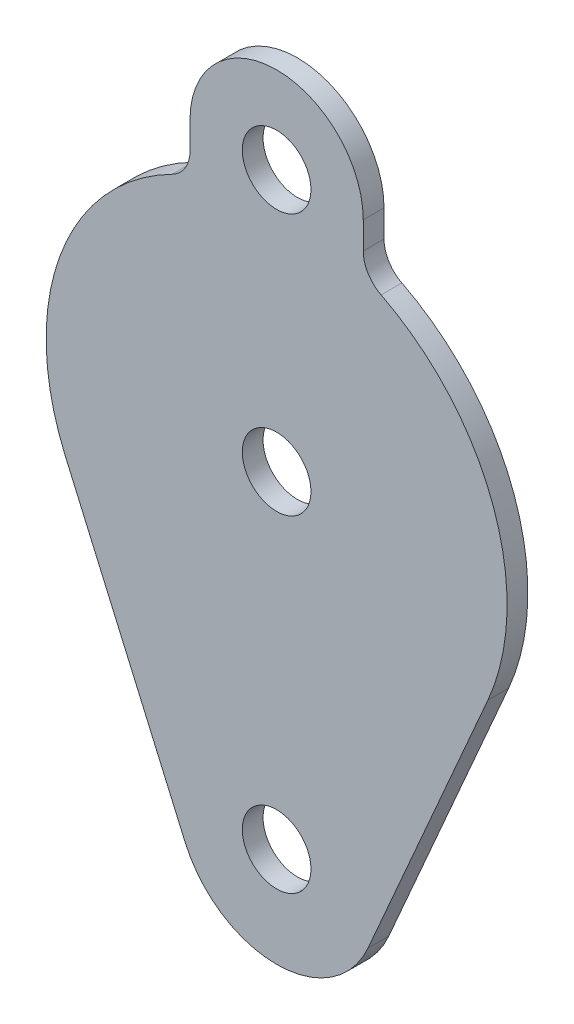
ISO-10303-21;
HEADER;
FILE_DESCRIPTION(('STEP AP214'),'2;1');
FILE_NAME('part.step','',(''),(''),'','','');
FILE_SCHEMA(('AUTOMOTIVE_DESIGN { 1 0 10303 214 1 1 1 1 }'));
ENDSEC;
DATA;
#1=APPLICATION_CONTEXT('core data for automotive mechanical design processes');
#2=APPLICATION_PROTOCOL_DEFINITION('international standard','automotive_design',2000,#1);
#3=PRODUCT_CONTEXT('',#1,'mechanical');
#4=PRODUCT('Part','Part','',(#3));
#5=PRODUCT_RELATED_PRODUCT_CATEGORY('part','',(#4));
#6=PRODUCT_DEFINITION_FORMATION('','',#4);
#7=PRODUCT_DEFINITION_CONTEXT('part definition',#1,'design');
#8=PRODUCT_DEFINITION('design','',#6,#7);
#9=PRODUCT_DEFINITION_SHAPE('','',#8);
#10=(LENGTH_UNIT() NAMED_UNIT(*) SI_UNIT(.MILLI.,.METRE.));
#11=(NAMED_UNIT(*) PLANE_ANGLE_UNIT() SI_UNIT($,.RADIAN.));
#12=(NAMED_UNIT(*) SI_UNIT($,.STERADIAN.) SOLID_ANGLE_UNIT());
#13=UNCERTAINTY_MEASURE_WITH_UNIT(LENGTH_MEASURE(1.E-05),#10,'distance_accuracy_value','');
#14=(GEOMETRIC_REPRESENTATION_CONTEXT(3) GLOBAL_UNCERTAINTY_ASSIGNED_CONTEXT((#13)) GLOBAL_UNIT_ASSIGNED_CONTEXT((#10,
#11,#12)) REPRESENTATION_CONTEXT('',''));
#15=CARTESIAN_POINT('',(0.,0.,0.));
#16=DIRECTION('',(0.,0.,1.));
#17=DIRECTION('',(1.,0.,0.));
#18=AXIS2_PLACEMENT_3D('',#15,#16,#17);
#19=CARTESIAN_POINT('',(-13.2500000000001,-111.042107482795,3.175));
#20=DIRECTION('',(1.,0.,0.));
#21=DIRECTION('',(0.,1.,0.));
#22=AXIS2_PLACEMENT_3D('',#19,#20,#21);
#23=PLANE('',#22);
#24=DIRECTION('',(0.,-1.,0.));
#25=VECTOR('',#24,1.);
#26=CARTESIAN_POINT('',(-13.2500000000001,-111.042107482795,0.));
#27=LINE('',#26,#25);
#28=CARTESIAN_POINT('',(-13.25,40.,0.));
#29=VERTEX_POINT('',#28);
#30=CARTESIAN_POINT('',(-13.25,35.8747822293042,0.));
#31=VERTEX_POINT('',#30);
#32=EDGE_CURVE('E156',#29,#31,#27,.T.);
#33=ORIENTED_EDGE('',*,*,#32,.T.);
#34=DIRECTION('',(0.,0.,1.));
#35=VECTOR('',#34,1.);
#36=CARTESIAN_POINT('',(-13.25,35.8747822293042,3.175));
#37=LINE('',#36,#35);
#38=CARTESIAN_POINT('',(-13.25,35.8747822293042,3.175));
#39=VERTEX_POINT('',#38);
#40=EDGE_CURVE('E47',#31,#39,#37,.T.);
#41=ORIENTED_EDGE('',*,*,#40,.T.);
#42=DIRECTION('',(0.,-1.,0.));
#43=VECTOR('',#42,1.);
#44=CARTESIAN_POINT('',(-13.2500000000001,-111.042107482795,3.175));
#45=LINE('',#44,#43);
#46=CARTESIAN_POINT('',(-13.25,40.,3.175));
#47=VERTEX_POINT('',#46);
#48=EDGE_CURVE('E119',#47,#39,#45,.T.);
#49=ORIENTED_EDGE('',*,*,#48,.F.);
#50=DIRECTION('',(0.,0.,-1.));
#51=VECTOR('',#50,1.);
#52=CARTESIAN_POINT('',(-13.25,40.,3.175));
#53=LINE('',#52,#51);
#54=EDGE_CURVE('E155',#47,#29,#53,.T.);
#55=ORIENTED_EDGE('',*,*,#54,.T.);
#56=EDGE_LOOP('',(#33,#41,#49,#55));
#57=FACE_BOUND('',#56,.T.);
#58=ADVANCED_FACE('F32',(#57),#23,.F.);
#59=CARTESIAN_POINT('',(0.,0.,3.175));
#60=DIRECTION('',(0.,0.,-1.));
#61=DIRECTION('',(-1.,0.,0.));
#62=AXIS2_PLACEMENT_3D('',#59,#60,#61);
#63=CYLINDRICAL_SURFACE('',#62,35.25);
#64=CARTESIAN_POINT('',(0.,0.,3.175));
#65=DIRECTION('',(0.,0.,1.));
#66=DIRECTION('',(1.,0.,0.));
#67=AXIS2_PLACEMENT_3D('',#64,#65,#66);
#68=CIRCLE('',#67,35.25);
#69=CARTESIAN_POINT('',(-15.9829192546584,31.4182875424341,3.175));
#70=VERTEX_POINT('',#69);
#71=CARTESIAN_POINT('',(-32.3071586494387,-14.1,3.175));
#72=VERTEX_POINT('',#71);
#73=EDGE_CURVE('E109',#70,#72,#68,.T.);
#74=ORIENTED_EDGE('',*,*,#73,.F.);
#75=DIRECTION('',(0.,0.,-1.));
#76=VECTOR('',#75,1.);
#77=CARTESIAN_POINT('',(-15.9829192546584,31.4182875424341,3.175));
#78=LINE('',#77,#76);
#79=CARTESIAN_POINT('',(-15.9829192546584,31.4182875424341,0.));
#80=VERTEX_POINT('',#79);
#81=EDGE_CURVE('E195',#70,#80,#78,.T.);
#82=ORIENTED_EDGE('',*,*,#81,.T.);
#83=CARTESIAN_POINT('',(0.,0.,0.));
#84=DIRECTION('',(0.,0.,1.));
#85=DIRECTION('',(1.,0.,0.));
#86=AXIS2_PLACEMENT_3D('',#83,#84,#85);
#87=CIRCLE('',#86,35.25);
#88=CARTESIAN_POINT('',(-32.3071586494387,-14.1,0.));
#89=VERTEX_POINT('',#88);
#90=EDGE_CURVE('E125',#80,#89,#87,.T.);
#91=ORIENTED_EDGE('',*,*,#90,.T.);
#92=DIRECTION('',(0.,0.,-1.));
#93=VECTOR('',#92,1.);
#94=CARTESIAN_POINT('',(-32.3071586494387,-14.1,3.175));
#95=LINE('',#94,#93);
#96=EDGE_CURVE('E123',#72,#89,#95,.T.);
#97=ORIENTED_EDGE('',*,*,#96,.F.);
#98=EDGE_LOOP('',(#74,#82,#91,#97));
#99=FACE_BOUND('',#98,.T.);
#100=ADVANCED_FACE('F124',(#99),#63,.T.);
#101=CARTESIAN_POINT('',(8.83797108746078,-108.37533574906,3.175));
#102=DIRECTION('',(-0.916515138991168,-0.4,0.));
#103=DIRECTION('',(0.4,-0.916515138991168,0.));
#104=AXIS2_PLACEMENT_3D('',#101,#102,#103);
#105=PLANE('',#104);
#106=DIRECTION('',(-0.4,0.916515138991168,0.));
#107=VECTOR('',#106,1.);
#108=CARTESIAN_POINT('',(8.83797108746078,-108.37533574906,0.));
#109=LINE('',#108,#107);
#110=CARTESIAN_POINT('',(-13.9768558696153,-56.1,0.));
#111=VERTEX_POINT('',#110);
#112=EDGE_CURVE('E159',#111,#89,#109,.T.);
#113=ORIENTED_EDGE('',*,*,#112,.F.);
#114=DIRECTION('',(0.,0.,-1.));
#115=VECTOR('',#114,1.);
#116=CARTESIAN_POINT('',(-13.9768558696153,-56.1,3.175));
#117=LINE('',#116,#115);
#118=CARTESIAN_POINT('',(-13.9768558696153,-56.1,3.175));
#119=VERTEX_POINT('',#118);
#120=EDGE_CURVE('E130',#119,#111,#117,.T.);
#121=ORIENTED_EDGE('',*,*,#120,.F.);
#122=DIRECTION('',(-0.4,0.916515138991168,0.));
#123=VECTOR('',#122,1.);
#124=CARTESIAN_POINT('',(8.83797108746078,-108.37533574906,3.175));
#125=LINE('',#124,#123);
#126=EDGE_CURVE('E114',#119,#72,#125,.T.);
#127=ORIENTED_EDGE('',*,*,#126,.T.);
#128=ORIENTED_EDGE('',*,*,#96,.T.);
#129=EDGE_LOOP('',(#113,#121,#127,#128));
#130=FACE_BOUND('',#129,.T.);
#131=ADVANCED_FACE('F132',(#130),#105,.T.);
#132=CARTESIAN_POINT('',(0.,-50.,3.175));
#133=DIRECTION('',(0.,0.,-1.));
#134=DIRECTION('',(-1.,0.,0.));
#135=AXIS2_PLACEMENT_3D('',#132,#133,#134);
#136=CYLINDRICAL_SURFACE('',#135,15.25);
#137=CARTESIAN_POINT('',(0.,-50.,0.));
#138=DIRECTION('',(0.,0.,1.));
#139=DIRECTION('',(1.,0.,0.));
#140=AXIS2_PLACEMENT_3D('',#137,#138,#139);
#141=CIRCLE('',#140,15.25);
#142=CARTESIAN_POINT('',(13.9768558696153,-56.1,0.));
#143=VERTEX_POINT('',#142);
#144=EDGE_CURVE('E162',#111,#143,#141,.T.);
#145=ORIENTED_EDGE('',*,*,#144,.T.);
#146=DIRECTION('',(0.,0.,-1.));
#147=VECTOR('',#146,1.);
#148=CARTESIAN_POINT('',(13.9768558696153,-56.1,3.175));
#149=LINE('',#148,#147);
#150=CARTESIAN_POINT('',(13.9768558696153,-56.1,3.175));
#151=VERTEX_POINT('',#150);
#152=EDGE_CURVE('E187',#151,#143,#149,.T.);
#153=ORIENTED_EDGE('',*,*,#152,.F.);
#154=CARTESIAN_POINT('',(0.,-50.,3.175));
#155=DIRECTION('',(0.,0.,1.));
#156=DIRECTION('',(1.,0.,0.));
#157=AXIS2_PLACEMENT_3D('',#154,#155,#156);
#158=CIRCLE('',#157,15.25);
#159=EDGE_CURVE('E134',#119,#151,#158,.T.);
#160=ORIENTED_EDGE('',*,*,#159,.F.);
#161=ORIENTED_EDGE('',*,*,#120,.T.);
#162=EDGE_LOOP('',(#145,#153,#160,#161));
#163=FACE_BOUND('',#162,.T.);
#164=ADVANCED_FACE('F228',(#163),#136,.T.);
#165=CARTESIAN_POINT('',(-7.96512967243461,-106.375404822035,3.175));
#166=DIRECTION('',(-0.916515138991168,0.4,0.));
#167=DIRECTION('',(-0.4,-0.916515138991168,0.));
#168=AXIS2_PLACEMENT_3D('',#165,#166,#167);
#169=PLANE('',#168);
#170=DIRECTION('',(0.4,0.916515138991168,0.));
#171=VECTOR('',#170,1.);
#172=CARTESIAN_POINT('',(-7.96512967243461,-106.375404822035,0.));
#173=LINE('',#172,#171);
#174=CARTESIAN_POINT('',(32.3071586494387,-14.1,0.));
#175=VERTEX_POINT('',#174);
#176=EDGE_CURVE('E164',#143,#175,#173,.T.);
#177=ORIENTED_EDGE('',*,*,#176,.T.);
#178=DIRECTION('',(0.,0.,-1.));
#179=VECTOR('',#178,1.);
#180=CARTESIAN_POINT('',(32.3071586494387,-14.1,3.175));
#181=LINE('',#180,#179);
#182=CARTESIAN_POINT('',(32.3071586494387,-14.1,3.175));
#183=VERTEX_POINT('',#182);
#184=EDGE_CURVE('E184',#183,#175,#181,.T.);
#185=ORIENTED_EDGE('',*,*,#184,.F.);
#186=DIRECTION('',(0.4,0.916515138991168,0.));
#187=VECTOR('',#186,1.);
#188=CARTESIAN_POINT('',(-7.96512967243461,-106.375404822035,3.175));
#189=LINE('',#188,#187);
#190=EDGE_CURVE('E136',#151,#183,#189,.T.);
#191=ORIENTED_EDGE('',*,*,#190,.F.);
#192=ORIENTED_EDGE('',*,*,#152,.T.);
#193=EDGE_LOOP('',(#177,#185,#191,#192));
#194=FACE_BOUND('',#193,.T.);
#195=ADVANCED_FACE('F224',(#194),#169,.F.);
#196=CARTESIAN_POINT('',(15.9829192546584,31.4182875424341,0.));
#197=VERTEX_POINT('',#196);
#198=EDGE_CURVE('E160',#175,#197,#87,.T.);
#199=ORIENTED_EDGE('',*,*,#198,.T.);
#200=DIRECTION('',(0.,0.,-1.));
#201=VECTOR('',#200,1.);
#202=CARTESIAN_POINT('',(15.9829192546584,31.4182875424341,3.175));
#203=LINE('',#202,#201);
#204=CARTESIAN_POINT('',(15.9829192546584,31.4182875424341,3.175));
#205=VERTEX_POINT('',#204);
#206=EDGE_CURVE('E193',#197,#205,#203,.F.);
#207=ORIENTED_EDGE('',*,*,#206,.T.);
#208=EDGE_CURVE('E121',#183,#205,#68,.T.);
#209=ORIENTED_EDGE('',*,*,#208,.F.);
#210=ORIENTED_EDGE('',*,*,#184,.T.);
#211=EDGE_LOOP('',(#199,#207,#209,#210));
#212=FACE_BOUND('',#211,.T.);
#213=ADVANCED_FACE('F220',(#212),#63,.T.);
#214=CARTESIAN_POINT('',(13.2500000000001,-111.042107482795,3.175));
#215=DIRECTION('',(1.,0.,0.));
#216=DIRECTION('',(0.,1.,0.));
#217=AXIS2_PLACEMENT_3D('',#214,#215,#216);
#218=PLANE('',#217);
#219=DIRECTION('',(0.,-1.,0.));
#220=VECTOR('',#219,1.);
#221=CARTESIAN_POINT('',(13.2500000000001,-111.042107482795,3.175));
#222=LINE('',#221,#220);
#223=CARTESIAN_POINT('',(13.25,40.,3.175));
#224=VERTEX_POINT('',#223);
#225=CARTESIAN_POINT('',(13.25,35.8747822293042,3.175));
#226=VERTEX_POINT('',#225);
#227=EDGE_CURVE('E141',#224,#226,#222,.T.);
#228=ORIENTED_EDGE('',*,*,#227,.T.);
#229=DIRECTION('',(0.,0.,-1.));
#230=VECTOR('',#229,1.);
#231=CARTESIAN_POINT('',(13.25,35.8747822293042,3.175));
#232=LINE('',#231,#230);
#233=CARTESIAN_POINT('',(13.25,35.8747822293042,0.));
#234=VERTEX_POINT('',#233);
#235=EDGE_CURVE('E129',#226,#234,#232,.T.);
#236=ORIENTED_EDGE('',*,*,#235,.T.);
#237=DIRECTION('',(0.,-1.,0.));
#238=VECTOR('',#237,1.);
#239=CARTESIAN_POINT('',(13.2500000000001,-111.042107482795,0.));
#240=LINE('',#239,#238);
#241=CARTESIAN_POINT('',(13.25,40.,0.));
#242=VERTEX_POINT('',#241);
#243=EDGE_CURVE('E166',#242,#234,#240,.T.);
#244=ORIENTED_EDGE('',*,*,#243,.F.);
#245=DIRECTION('',(0.,0.,-1.));
#246=VECTOR('',#245,1.);
#247=CARTESIAN_POINT('',(13.25,40.,3.175));
#248=LINE('',#247,#246);
#249=EDGE_CURVE('E182',#224,#242,#248,.T.);
#250=ORIENTED_EDGE('',*,*,#249,.F.);
#251=EDGE_LOOP('',(#228,#236,#244,#250));
#252=FACE_BOUND('',#251,.T.);
#253=ADVANCED_FACE('F209',(#252),#218,.T.);
#254=CARTESIAN_POINT('',(0.,0.,3.175));
#255=DIRECTION('',(0.,0.,-1.));
#256=DIRECTION('',(-1.,0.,0.));
#257=AXIS2_PLACEMENT_3D('',#254,#255,#256);
#258=CYLINDRICAL_SURFACE('',#257,5.25);
#259=CARTESIAN_POINT('',(0.,0.,3.175));
#260=DIRECTION('',(0.,0.,1.));
#261=DIRECTION('',(1.,0.,0.));
#262=AXIS2_PLACEMENT_3D('',#259,#260,#261);
#263=CIRCLE('',#262,5.25);
#264=CARTESIAN_POINT('',(5.25,0.,3.175));
#265=VERTEX_POINT('',#264);
#266=EDGE_CURVE('E149',#265,#265,#263,.T.);
#267=ORIENTED_EDGE('',*,*,#266,.T.);
#268=EDGE_LOOP('',(#267));
#269=FACE_BOUND('',#268,.T.);
#270=CARTESIAN_POINT('',(0.,0.,0.));
#271=DIRECTION('',(0.,0.,1.));
#272=DIRECTION('',(1.,0.,0.));
#273=AXIS2_PLACEMENT_3D('',#270,#271,#272);
#274=CIRCLE('',#273,5.25);
#275=CARTESIAN_POINT('',(5.25,0.,0.));
#276=VERTEX_POINT('',#275);
#277=EDGE_CURVE('E174',#276,#276,#274,.T.);
#278=ORIENTED_EDGE('',*,*,#277,.F.);
#279=EDGE_LOOP('',(#278));
#280=FACE_BOUND('',#279,.T.);
#281=ADVANCED_FACE('F260',(#269,#280),#258,.F.);
#282=CARTESIAN_POINT('',(0.,40.,3.175));
#283=DIRECTION('',(0.,0.,-1.));
#284=DIRECTION('',(-1.,0.,0.));
#285=AXIS2_PLACEMENT_3D('',#282,#283,#284);
#286=CYLINDRICAL_SURFACE('',#285,5.25);
#287=CARTESIAN_POINT('',(0.,40.,3.175));
#288=DIRECTION('',(0.,0.,1.));
#289=DIRECTION('',(1.,0.,0.));
#290=AXIS2_PLACEMENT_3D('',#287,#288,#289);
#291=CIRCLE('',#290,5.25);
#292=CARTESIAN_POINT('',(5.25,40.,3.175));
#293=VERTEX_POINT('',#292);
#294=EDGE_CURVE('E146',#293,#293,#291,.T.);
#295=ORIENTED_EDGE('',*,*,#294,.T.);
#296=EDGE_LOOP('',(#295));
#297=FACE_BOUND('',#296,.T.);
#298=CARTESIAN_POINT('',(0.,40.,0.));
#299=DIRECTION('',(0.,0.,1.));
#300=DIRECTION('',(1.,0.,0.));
#301=AXIS2_PLACEMENT_3D('',#298,#299,#300);
#302=CIRCLE('',#301,5.25);
#303=CARTESIAN_POINT('',(5.25,40.,0.));
#304=VERTEX_POINT('',#303);
#305=EDGE_CURVE('E171',#304,#304,#302,.T.);
#306=ORIENTED_EDGE('',*,*,#305,.F.);
#307=EDGE_LOOP('',(#306));
#308=FACE_BOUND('',#307,.T.);
#309=ADVANCED_FACE('F263',(#297,#308),#286,.F.);
#310=CARTESIAN_POINT('',(0.,40.,3.175));
#311=DIRECTION('',(0.,0.,-1.));
#312=DIRECTION('',(-1.,0.,0.));
#313=AXIS2_PLACEMENT_3D('',#310,#311,#312);
#314=CYLINDRICAL_SURFACE('',#313,13.25);
#315=CARTESIAN_POINT('',(0.,40.,0.));
#316=DIRECTION('',(0.,0.,1.));
#317=DIRECTION('',(1.,0.,0.));
#318=AXIS2_PLACEMENT_3D('',#315,#316,#317);
#319=CIRCLE('',#318,13.25);
#320=EDGE_CURVE('E169',#242,#29,#319,.T.);
#321=ORIENTED_EDGE('',*,*,#320,.T.);
#322=ORIENTED_EDGE('',*,*,#54,.F.);
#323=CARTESIAN_POINT('',(0.,40.,3.175));
#324=DIRECTION('',(0.,0.,1.));
#325=DIRECTION('',(1.,0.,0.));
#326=AXIS2_PLACEMENT_3D('',#323,#324,#325);
#327=CIRCLE('',#326,13.25);
#328=EDGE_CURVE('E144',#224,#47,#327,.T.);
#329=ORIENTED_EDGE('',*,*,#328,.F.);
#330=ORIENTED_EDGE('',*,*,#249,.T.);
#331=EDGE_LOOP('',(#321,#322,#329,#330));
#332=FACE_BOUND('',#331,.T.);
#333=ADVANCED_FACE('F258',(#332),#314,.T.);
#334=CARTESIAN_POINT('',(0.,-50.,3.175));
#335=DIRECTION('',(0.,0.,-1.));
#336=DIRECTION('',(-1.,0.,0.));
#337=AXIS2_PLACEMENT_3D('',#334,#335,#336);
#338=CYLINDRICAL_SURFACE('',#337,5.25);
#339=CARTESIAN_POINT('',(0.,-50.,3.175));
#340=DIRECTION('',(0.,0.,1.));
#341=DIRECTION('',(1.,0.,0.));
#342=AXIS2_PLACEMENT_3D('',#339,#340,#341);
#343=CIRCLE('',#342,5.25);
#344=CARTESIAN_POINT('',(5.25,-50.,3.175));
#345=VERTEX_POINT('',#344);
#346=EDGE_CURVE('E152',#345,#345,#343,.T.);
#347=ORIENTED_EDGE('',*,*,#346,.T.);
#348=EDGE_LOOP('',(#347));
#349=FACE_BOUND('',#348,.T.);
#350=CARTESIAN_POINT('',(0.,-50.,0.));
#351=DIRECTION('',(0.,0.,1.));
#352=DIRECTION('',(1.,0.,0.));
#353=AXIS2_PLACEMENT_3D('',#350,#351,#352);
#354=CIRCLE('',#353,5.25);
#355=CARTESIAN_POINT('',(5.25,-50.,0.));
#356=VERTEX_POINT('',#355);
#357=EDGE_CURVE('E177',#356,#356,#354,.T.);
#358=ORIENTED_EDGE('',*,*,#357,.F.);
#359=EDGE_LOOP('',(#358));
#360=FACE_BOUND('',#359,.T.);
#361=ADVANCED_FACE('F253',(#349,#360),#338,.F.);
#362=CARTESIAN_POINT('',(2.72762942195674,-111.042107482795,3.175));
#363=DIRECTION('',(0.,0.,1.));
#364=DIRECTION('',(1.,0.,0.));
#365=AXIS2_PLACEMENT_3D('',#362,#363,#364);
#366=PLANE('',#365);
#367=ORIENTED_EDGE('',*,*,#48,.T.);
#368=CARTESIAN_POINT('',(-18.25,35.8747822293042,3.175));
#369=DIRECTION('',(0.,0.,1.));
#370=DIRECTION('',(1.,0.,0.));
#371=AXIS2_PLACEMENT_3D('',#368,#369,#370);
#372=CIRCLE('',#371,5.);
#373=EDGE_CURVE('E11',#39,#70,#372,.F.);
#374=ORIENTED_EDGE('',*,*,#373,.T.);
#375=ORIENTED_EDGE('',*,*,#73,.T.);
#376=ORIENTED_EDGE('',*,*,#126,.F.);
#377=ORIENTED_EDGE('',*,*,#159,.T.);
#378=ORIENTED_EDGE('',*,*,#190,.T.);
#379=ORIENTED_EDGE('',*,*,#208,.T.);
#380=CARTESIAN_POINT('',(18.25,35.8747822293042,3.175));
#381=DIRECTION('',(0.,0.,1.));
#382=DIRECTION('',(1.,0.,0.));
#383=AXIS2_PLACEMENT_3D('',#380,#381,#382);
#384=CIRCLE('',#383,5.);
#385=EDGE_CURVE('E200',#205,#226,#384,.F.);
#386=ORIENTED_EDGE('',*,*,#385,.T.);
#387=ORIENTED_EDGE('',*,*,#227,.F.);
#388=ORIENTED_EDGE('',*,*,#328,.T.);
#389=EDGE_LOOP('',(#367,#374,#375,#376,#377,#378,#379,#386,#387,#388));
#390=FACE_BOUND('',#389,.T.);
#391=ORIENTED_EDGE('',*,*,#294,.F.);
#392=EDGE_LOOP('',(#391));
#393=FACE_BOUND('',#392,.T.);
#394=ORIENTED_EDGE('',*,*,#266,.F.);
#395=EDGE_LOOP('',(#394));
#396=FACE_BOUND('',#395,.T.);
#397=ORIENTED_EDGE('',*,*,#346,.F.);
#398=EDGE_LOOP('',(#397));
#399=FACE_BOUND('',#398,.T.);
#400=ADVANCED_FACE('F111',(#390,#393,#396,#399),#366,.T.);
#401=CARTESIAN_POINT('',(2.72762942195674,-111.042107482795,0.));
#402=DIRECTION('',(0.,0.,1.));
#403=DIRECTION('',(1.,0.,0.));
#404=AXIS2_PLACEMENT_3D('',#401,#402,#403);
#405=PLANE('',#404);
#406=ORIENTED_EDGE('',*,*,#32,.F.);
#407=ORIENTED_EDGE('',*,*,#320,.F.);
#408=ORIENTED_EDGE('',*,*,#243,.T.);
#409=CARTESIAN_POINT('',(18.25,35.8747822293042,0.));
#410=DIRECTION('',(0.,0.,1.));
#411=DIRECTION('',(1.,0.,0.));
#412=AXIS2_PLACEMENT_3D('',#409,#410,#411);
#413=CIRCLE('',#412,5.);
#414=EDGE_CURVE('E198',#234,#197,#413,.T.);
#415=ORIENTED_EDGE('',*,*,#414,.T.);
#416=ORIENTED_EDGE('',*,*,#198,.F.);
#417=ORIENTED_EDGE('',*,*,#176,.F.);
#418=ORIENTED_EDGE('',*,*,#144,.F.);
#419=ORIENTED_EDGE('',*,*,#112,.T.);
#420=ORIENTED_EDGE('',*,*,#90,.F.);
#421=CARTESIAN_POINT('',(-18.25,35.8747822293042,0.));
#422=DIRECTION('',(0.,0.,1.));
#423=DIRECTION('',(1.,0.,0.));
#424=AXIS2_PLACEMENT_3D('',#421,#422,#423);
#425=CIRCLE('',#424,5.);
#426=EDGE_CURVE('E40',#80,#31,#425,.T.);
#427=ORIENTED_EDGE('',*,*,#426,.T.);
#428=EDGE_LOOP('',(#406,#407,#408,#415,#416,#417,#418,#419,#420,#427));
#429=FACE_BOUND('',#428,.T.);
#430=ORIENTED_EDGE('',*,*,#305,.T.);
#431=EDGE_LOOP('',(#430));
#432=FACE_BOUND('',#431,.T.);
#433=ORIENTED_EDGE('',*,*,#277,.T.);
#434=EDGE_LOOP('',(#433));
#435=FACE_BOUND('',#434,.T.);
#436=ORIENTED_EDGE('',*,*,#357,.T.);
#437=EDGE_LOOP('',(#436));
#438=FACE_BOUND('',#437,.T.);
#439=ADVANCED_FACE('F215',(#429,#432,#435,#438),#405,.F.);
#440=CARTESIAN_POINT('',(18.25,35.8747822293042,3.175));
#441=DIRECTION('',(0.,0.,-1.));
#442=DIRECTION('',(-1.,0.,0.));
#443=AXIS2_PLACEMENT_3D('',#440,#441,#442);
#444=CYLINDRICAL_SURFACE('',#443,5.);
#445=ORIENTED_EDGE('',*,*,#385,.F.);
#446=ORIENTED_EDGE('',*,*,#206,.F.);
#447=ORIENTED_EDGE('',*,*,#414,.F.);
#448=ORIENTED_EDGE('',*,*,#235,.F.);
#449=EDGE_LOOP('',(#445,#446,#447,#448));
#450=FACE_BOUND('',#449,.T.);
#451=ADVANCED_FACE('F212',(#450),#444,.F.);
#452=CARTESIAN_POINT('',(-18.25,35.8747822293042,3.175));
#453=DIRECTION('',(0.,0.,-1.));
#454=DIRECTION('',(-1.,0.,0.));
#455=AXIS2_PLACEMENT_3D('',#452,#453,#454);
#456=CYLINDRICAL_SURFACE('',#455,5.);
#457=ORIENTED_EDGE('',*,*,#373,.F.);
#458=ORIENTED_EDGE('',*,*,#40,.F.);
#459=ORIENTED_EDGE('',*,*,#426,.F.);
#460=ORIENTED_EDGE('',*,*,#81,.F.);
#461=EDGE_LOOP('',(#457,#458,#459,#460));
#462=FACE_BOUND('',#461,.T.);
#463=ADVANCED_FACE('F34',(#462),#456,.F.);
#464=CLOSED_SHELL('',(#58,#100,#131,#164,#195,#213,#253,#281,#309,#333,#361,#400,#439,#451,#463));
#465=MANIFOLD_SOLID_BREP('B2',#464);
#466=ADVANCED_BREP_SHAPE_REPRESENTATION('',(#18,#465),#14);
#467=SHAPE_DEFINITION_REPRESENTATION(#9,#466);
ENDSEC;
END-ISO-10303-21;
